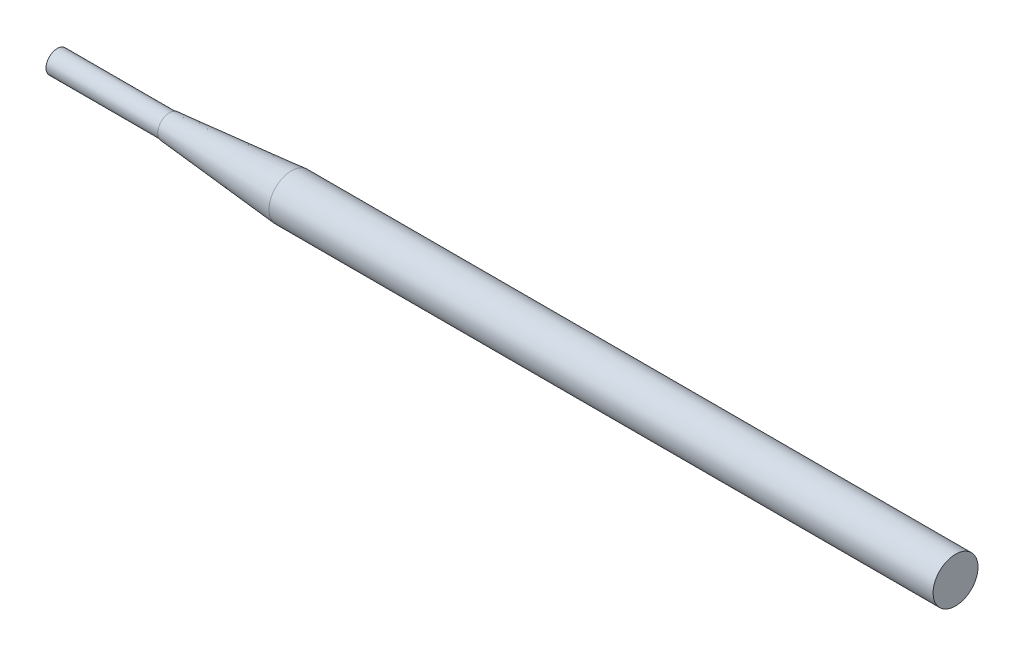
ISO-10303-21;
HEADER;
FILE_DESCRIPTION(('STEP AP214'),'2;1');
FILE_NAME('part.step','',(''),(''),'','','');
FILE_SCHEMA(('AUTOMOTIVE_DESIGN { 1 0 10303 214 1 1 1 1 }'));
ENDSEC;
DATA;
#1=APPLICATION_CONTEXT('core data for automotive mechanical design processes');
#2=APPLICATION_PROTOCOL_DEFINITION('international standard','automotive_design',2000,#1);
#3=PRODUCT_CONTEXT('',#1,'mechanical');
#4=PRODUCT('Part','Part','',(#3));
#5=PRODUCT_RELATED_PRODUCT_CATEGORY('part','',(#4));
#6=PRODUCT_DEFINITION_FORMATION('','',#4);
#7=PRODUCT_DEFINITION_CONTEXT('part definition',#1,'design');
#8=PRODUCT_DEFINITION('design','',#6,#7);
#9=PRODUCT_DEFINITION_SHAPE('','',#8);
#10=(LENGTH_UNIT() NAMED_UNIT(*) SI_UNIT(.MILLI.,.METRE.));
#11=(NAMED_UNIT(*) PLANE_ANGLE_UNIT() SI_UNIT($,.RADIAN.));
#12=(NAMED_UNIT(*) SI_UNIT($,.STERADIAN.) SOLID_ANGLE_UNIT());
#13=UNCERTAINTY_MEASURE_WITH_UNIT(LENGTH_MEASURE(1.E-05),#10,'distance_accuracy_value','');
#14=(GEOMETRIC_REPRESENTATION_CONTEXT(3) GLOBAL_UNCERTAINTY_ASSIGNED_CONTEXT((#13)) GLOBAL_UNIT_ASSIGNED_CONTEXT((#10,
#11,#12)) REPRESENTATION_CONTEXT('',''));
#15=CARTESIAN_POINT('',(0.,0.,0.));
#16=DIRECTION('',(0.,0.,1.));
#17=DIRECTION('',(1.,0.,0.));
#18=AXIS2_PLACEMENT_3D('',#15,#16,#17);
#19=CARTESIAN_POINT('',(100.,0.,0.));
#20=DIRECTION('',(1.,0.,0.));
#21=DIRECTION('',(0.,0.,-1.));
#22=AXIS2_PLACEMENT_3D('',#19,#20,#21);
#23=PLANE('',#22);
#24=CARTESIAN_POINT('',(100.,0.,0.));
#25=DIRECTION('',(1.,0.,0.));
#26=DIRECTION('',(0.,0.,-1.));
#27=AXIS2_PLACEMENT_3D('',#24,#25,#26);
#28=CIRCLE('',#27,10.);
#29=CARTESIAN_POINT('',(100.,0.,-10.));
#30=VERTEX_POINT('',#29);
#31=EDGE_CURVE('E11',#30,#30,#28,.T.);
#32=ORIENTED_EDGE('',*,*,#31,.T.);
#33=EDGE_LOOP('',(#32));
#34=FACE_BOUND('',#33,.T.);
#35=CARTESIAN_POINT('',(100.,0.,0.));
#36=DIRECTION('',(-1.,0.,0.));
#37=DIRECTION('',(0.,0.,1.));
#38=AXIS2_PLACEMENT_3D('',#35,#36,#37);
#39=CIRCLE('',#38,10.5);
#40=CARTESIAN_POINT('',(100.,0.,10.5));
#41=VERTEX_POINT('',#40);
#42=EDGE_CURVE('E64',#41,#41,#39,.T.);
#43=ORIENTED_EDGE('',*,*,#42,.T.);
#44=EDGE_LOOP('',(#43));
#45=FACE_BOUND('',#44,.T.);
#46=ADVANCED_FACE('F42',(#34,#45),#23,.F.);
#47=CARTESIAN_POINT('',(100.,0.,0.));
#48=DIRECTION('',(-1.,0.,0.));
#49=DIRECTION('',(0.,0.,1.));
#50=AXIS2_PLACEMENT_3D('',#47,#48,#49);
#51=CYLINDRICAL_SURFACE('',#50,10.);
#52=ORIENTED_EDGE('',*,*,#31,.F.);
#53=EDGE_LOOP('',(#52));
#54=FACE_BOUND('',#53,.T.);
#55=CARTESIAN_POINT('',(0.,0.,0.));
#56=DIRECTION('',(1.,0.,0.));
#57=DIRECTION('',(0.,0.,-1.));
#58=AXIS2_PLACEMENT_3D('',#55,#56,#57);
#59=CIRCLE('',#58,10.);
#60=CARTESIAN_POINT('',(0.,0.,-10.));
#61=VERTEX_POINT('',#60);
#62=EDGE_CURVE('E46',#61,#61,#59,.T.);
#63=ORIENTED_EDGE('',*,*,#62,.T.);
#64=EDGE_LOOP('',(#63));
#65=FACE_BOUND('',#64,.T.);
#66=ADVANCED_FACE('F44',(#54,#65),#51,.T.);
#67=CARTESIAN_POINT('',(0.,0.,0.));
#68=DIRECTION('',(1.,0.,0.));
#69=DIRECTION('',(0.,0.,-1.));
#70=AXIS2_PLACEMENT_3D('',#67,#68,#69);
#71=PLANE('',#70);
#72=ORIENTED_EDGE('',*,*,#62,.F.);
#73=EDGE_LOOP('',(#72));
#74=FACE_BOUND('',#73,.T.);
#75=ADVANCED_FACE('F74',(#74),#71,.F.);
#76=CARTESIAN_POINT('',(100.,0.,0.));
#77=DIRECTION('',(1.,0.,0.));
#78=DIRECTION('',(0.,0.,1.));
#79=AXIS2_PLACEMENT_3D('',#76,#77,#78);
#80=CONICAL_SURFACE('',#79,10.5,0.0872664625997165);
#81=ORIENTED_EDGE('',*,*,#42,.F.);
#82=EDGE_LOOP('',(#81));
#83=FACE_BOUND('',#82,.T.);
#84=CARTESIAN_POINT('',(208.585496876233,0.,0.));
#85=DIRECTION('',(1.,0.,0.));
#86=DIRECTION('',(0.,0.,-1.));
#87=AXIS2_PLACEMENT_3D('',#84,#85,#86);
#88=CIRCLE('',#87,20.);
#89=CARTESIAN_POINT('',(208.585496876233,0.,-20.));
#90=VERTEX_POINT('',#89);
#91=EDGE_CURVE('E60',#90,#90,#88,.F.);
#92=ORIENTED_EDGE('',*,*,#91,.T.);
#93=EDGE_LOOP('',(#92));
#94=FACE_BOUND('',#93,.T.);
#95=ADVANCED_FACE('F70',(#83,#94),#80,.T.);
#96=CARTESIAN_POINT('',(800.,0.,0.));
#97=DIRECTION('',(1.,0.,0.));
#98=DIRECTION('',(0.,0.,-1.));
#99=AXIS2_PLACEMENT_3D('',#96,#97,#98);
#100=PLANE('',#99);
#101=CARTESIAN_POINT('',(800.,0.,0.));
#102=DIRECTION('',(1.,0.,0.));
#103=DIRECTION('',(0.,0.,-1.));
#104=AXIS2_PLACEMENT_3D('',#101,#102,#103);
#105=CIRCLE('',#104,20.);
#106=CARTESIAN_POINT('',(800.,0.,-20.));
#107=VERTEX_POINT('',#106);
#108=EDGE_CURVE('E55',#107,#107,#105,.T.);
#109=ORIENTED_EDGE('',*,*,#108,.T.);
#110=EDGE_LOOP('',(#109));
#111=FACE_BOUND('',#110,.T.);
#112=ADVANCED_FACE('F73',(#111),#100,.T.);
#113=CARTESIAN_POINT('',(800.,0.,0.));
#114=DIRECTION('',(-1.,0.,0.));
#115=DIRECTION('',(0.,0.,1.));
#116=AXIS2_PLACEMENT_3D('',#113,#114,#115);
#117=CYLINDRICAL_SURFACE('',#116,20.);
#118=ORIENTED_EDGE('',*,*,#108,.F.);
#119=EDGE_LOOP('',(#118));
#120=FACE_BOUND('',#119,.T.);
#121=ORIENTED_EDGE('',*,*,#91,.F.);
#122=EDGE_LOOP('',(#121));
#123=FACE_BOUND('',#122,.T.);
#124=ADVANCED_FACE('F78',(#120,#123),#117,.T.);
#125=CLOSED_SHELL('',(#46,#66,#75,#95,#112,#124));
#126=MANIFOLD_SOLID_BREP('B2',#125);
#127=ADVANCED_BREP_SHAPE_REPRESENTATION('',(#18,#126),#14);
#128=SHAPE_DEFINITION_REPRESENTATION(#9,#127);
ENDSEC;
END-ISO-10303-21;
